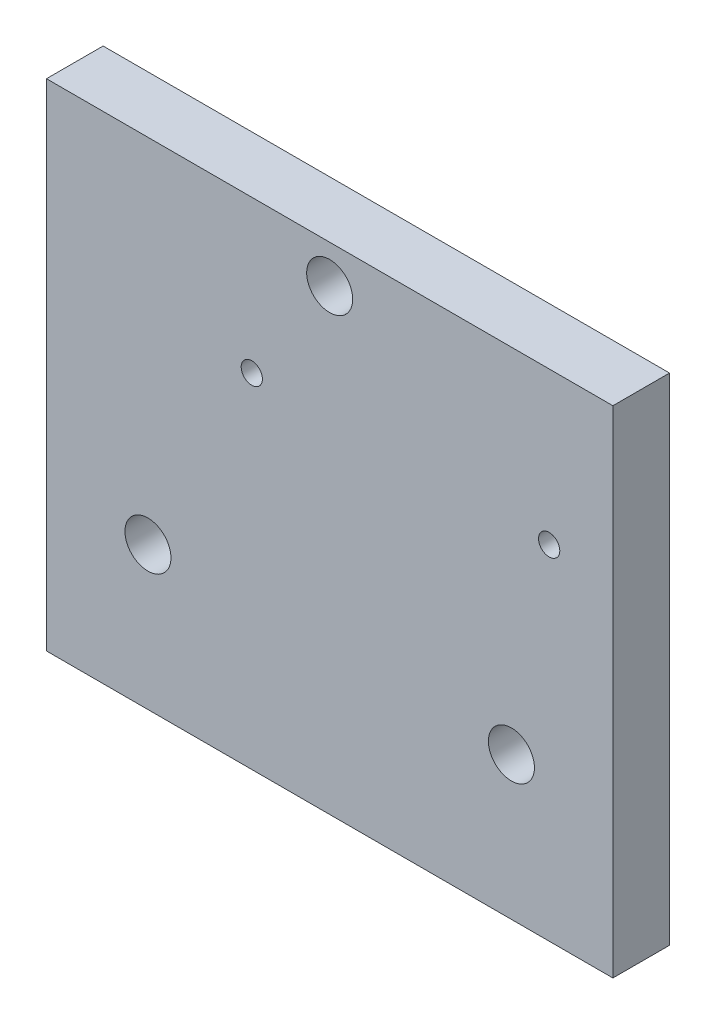
ISO-10303-21;
HEADER;
FILE_DESCRIPTION(('STEP AP214'),'2;1');
FILE_NAME('part.step','',(''),(''),'','','');
FILE_SCHEMA(('AUTOMOTIVE_DESIGN { 1 0 10303 214 1 1 1 1 }'));
ENDSEC;
DATA;
#1=APPLICATION_CONTEXT('core data for automotive mechanical design processes');
#2=APPLICATION_PROTOCOL_DEFINITION('international standard','automotive_design',2000,#1);
#3=PRODUCT_CONTEXT('',#1,'mechanical');
#4=PRODUCT('Part','Part','',(#3));
#5=PRODUCT_RELATED_PRODUCT_CATEGORY('part','',(#4));
#6=PRODUCT_DEFINITION_FORMATION('','',#4);
#7=PRODUCT_DEFINITION_CONTEXT('part definition',#1,'design');
#8=PRODUCT_DEFINITION('design','',#6,#7);
#9=PRODUCT_DEFINITION_SHAPE('','',#8);
#10=(LENGTH_UNIT() NAMED_UNIT(*) SI_UNIT(.MILLI.,.METRE.));
#11=(NAMED_UNIT(*) PLANE_ANGLE_UNIT() SI_UNIT($,.RADIAN.));
#12=(NAMED_UNIT(*) SI_UNIT($,.STERADIAN.) SOLID_ANGLE_UNIT());
#13=UNCERTAINTY_MEASURE_WITH_UNIT(LENGTH_MEASURE(1.E-05),#10,'distance_accuracy_value','');
#14=(GEOMETRIC_REPRESENTATION_CONTEXT(3) GLOBAL_UNCERTAINTY_ASSIGNED_CONTEXT((#13)) GLOBAL_UNIT_ASSIGNED_CONTEXT((#10,
#11,#12)) REPRESENTATION_CONTEXT('',''));
#15=CARTESIAN_POINT('',(0.,0.,0.));
#16=DIRECTION('',(0.,0.,1.));
#17=DIRECTION('',(1.,0.,0.));
#18=AXIS2_PLACEMENT_3D('',#15,#16,#17);
#19=CARTESIAN_POINT('',(0.,0.,16.));
#20=DIRECTION('',(-1.,0.,0.));
#21=DIRECTION('',(0.,-1.,0.));
#22=AXIS2_PLACEMENT_3D('',#19,#20,#21);
#23=PLANE('',#22);
#24=DIRECTION('',(0.,1.,0.));
#25=VECTOR('',#24,1.);
#26=CARTESIAN_POINT('',(0.,0.,0.));
#27=LINE('',#26,#25);
#28=CARTESIAN_POINT('',(0.,-140.,0.));
#29=VERTEX_POINT('',#28);
#30=CARTESIAN_POINT('',(0.,0.,0.));
#31=VERTEX_POINT('',#30);
#32=EDGE_CURVE('E98',#29,#31,#27,.T.);
#33=ORIENTED_EDGE('',*,*,#32,.T.);
#34=DIRECTION('',(0.,0.,-1.));
#35=VECTOR('',#34,1.);
#36=CARTESIAN_POINT('',(0.,0.,16.));
#37=LINE('',#36,#35);
#38=CARTESIAN_POINT('',(0.,0.,16.));
#39=VERTEX_POINT('',#38);
#40=EDGE_CURVE('E11',#39,#31,#37,.T.);
#41=ORIENTED_EDGE('',*,*,#40,.F.);
#42=DIRECTION('',(0.,1.,0.));
#43=VECTOR('',#42,1.);
#44=CARTESIAN_POINT('',(0.,0.,16.));
#45=LINE('',#44,#43);
#46=CARTESIAN_POINT('',(0.,-140.,16.));
#47=VERTEX_POINT('',#46);
#48=EDGE_CURVE('E86',#47,#39,#45,.T.);
#49=ORIENTED_EDGE('',*,*,#48,.F.);
#50=DIRECTION('',(0.,0.,-1.));
#51=VECTOR('',#50,1.);
#52=CARTESIAN_POINT('',(0.,-140.,16.));
#53=LINE('',#52,#51);
#54=EDGE_CURVE('E94',#47,#29,#53,.T.);
#55=ORIENTED_EDGE('',*,*,#54,.T.);
#56=EDGE_LOOP('',(#33,#41,#49,#55));
#57=FACE_BOUND('',#56,.T.);
#58=ADVANCED_FACE('F35',(#57),#23,.F.);
#59=CARTESIAN_POINT('',(0.,0.,16.));
#60=DIRECTION('',(0.,-1.,0.));
#61=DIRECTION('',(0.,0.,-1.));
#62=AXIS2_PLACEMENT_3D('',#59,#60,#61);
#63=PLANE('',#62);
#64=DIRECTION('',(-1.,0.,0.));
#65=VECTOR('',#64,1.);
#66=CARTESIAN_POINT('',(0.,0.,0.));
#67=LINE('',#66,#65);
#68=CARTESIAN_POINT('',(-160.,0.,0.));
#69=VERTEX_POINT('',#68);
#70=EDGE_CURVE('E90',#31,#69,#67,.T.);
#71=ORIENTED_EDGE('',*,*,#70,.T.);
#72=DIRECTION('',(0.,0.,-1.));
#73=VECTOR('',#72,1.);
#74=CARTESIAN_POINT('',(-160.,0.,16.));
#75=LINE('',#74,#73);
#76=CARTESIAN_POINT('',(-160.,0.,16.));
#77=VERTEX_POINT('',#76);
#78=EDGE_CURVE('E43',#77,#69,#75,.T.);
#79=ORIENTED_EDGE('',*,*,#78,.F.);
#80=DIRECTION('',(-1.,0.,0.));
#81=VECTOR('',#80,1.);
#82=CARTESIAN_POINT('',(0.,0.,16.));
#83=LINE('',#82,#81);
#84=EDGE_CURVE('E81',#39,#77,#83,.T.);
#85=ORIENTED_EDGE('',*,*,#84,.F.);
#86=ORIENTED_EDGE('',*,*,#40,.T.);
#87=EDGE_LOOP('',(#71,#79,#85,#86));
#88=FACE_BOUND('',#87,.T.);
#89=ADVANCED_FACE('F89',(#88),#63,.F.);
#90=CARTESIAN_POINT('',(-160.,0.,16.));
#91=DIRECTION('',(1.,0.,0.));
#92=DIRECTION('',(0.,1.,0.));
#93=AXIS2_PLACEMENT_3D('',#90,#91,#92);
#94=PLANE('',#93);
#95=DIRECTION('',(0.,-1.,0.));
#96=VECTOR('',#95,1.);
#97=CARTESIAN_POINT('',(-160.,0.,0.));
#98=LINE('',#97,#96);
#99=CARTESIAN_POINT('',(-160.,-140.,0.));
#100=VERTEX_POINT('',#99);
#101=EDGE_CURVE('E68',#69,#100,#98,.T.);
#102=ORIENTED_EDGE('',*,*,#101,.T.);
#103=DIRECTION('',(0.,0.,-1.));
#104=VECTOR('',#103,1.);
#105=CARTESIAN_POINT('',(-160.,-140.,16.));
#106=LINE('',#105,#104);
#107=CARTESIAN_POINT('',(-160.,-140.,16.));
#108=VERTEX_POINT('',#107);
#109=EDGE_CURVE('E91',#108,#100,#106,.T.);
#110=ORIENTED_EDGE('',*,*,#109,.F.);
#111=DIRECTION('',(0.,-1.,0.));
#112=VECTOR('',#111,1.);
#113=CARTESIAN_POINT('',(-160.,0.,16.));
#114=LINE('',#113,#112);
#115=EDGE_CURVE('E84',#77,#108,#114,.T.);
#116=ORIENTED_EDGE('',*,*,#115,.F.);
#117=ORIENTED_EDGE('',*,*,#78,.T.);
#118=EDGE_LOOP('',(#102,#110,#116,#117));
#119=FACE_BOUND('',#118,.T.);
#120=ADVANCED_FACE('F92',(#119),#94,.F.);
#121=CARTESIAN_POINT('',(0.,-140.,16.));
#122=DIRECTION('',(0.,1.,0.));
#123=DIRECTION('',(-1.,0.,0.));
#124=AXIS2_PLACEMENT_3D('',#121,#122,#123);
#125=PLANE('',#124);
#126=DIRECTION('',(1.,0.,0.));
#127=VECTOR('',#126,1.);
#128=CARTESIAN_POINT('',(0.,-140.,0.));
#129=LINE('',#128,#127);
#130=EDGE_CURVE('E74',#100,#29,#129,.T.);
#131=ORIENTED_EDGE('',*,*,#130,.T.);
#132=ORIENTED_EDGE('',*,*,#54,.F.);
#133=DIRECTION('',(1.,0.,0.));
#134=VECTOR('',#133,1.);
#135=CARTESIAN_POINT('',(0.,-140.,16.));
#136=LINE('',#135,#134);
#137=EDGE_CURVE('E51',#108,#47,#136,.T.);
#138=ORIENTED_EDGE('',*,*,#137,.F.);
#139=ORIENTED_EDGE('',*,*,#109,.T.);
#140=EDGE_LOOP('',(#131,#132,#138,#139));
#141=FACE_BOUND('',#140,.T.);
#142=ADVANCED_FACE('F106',(#141),#125,.F.);
#143=CARTESIAN_POINT('',(0.,0.,16.));
#144=DIRECTION('',(0.,0.,-1.));
#145=DIRECTION('',(-1.,0.,0.));
#146=AXIS2_PLACEMENT_3D('',#143,#144,#145);
#147=PLANE('',#146);
#148=CARTESIAN_POINT('',(-18.,-43.,16.));
#149=DIRECTION('',(0.,0.,1.));
#150=DIRECTION('',(1.,0.,0.));
#151=AXIS2_PLACEMENT_3D('',#148,#149,#150);
#152=CIRCLE('',#151,3.);
#153=CARTESIAN_POINT('',(-15.,-43.,16.));
#154=VERTEX_POINT('',#153);
#155=EDGE_CURVE('E136',#154,#154,#152,.T.);
#156=ORIENTED_EDGE('',*,*,#155,.F.);
#157=EDGE_LOOP('',(#156));
#158=FACE_BOUND('',#157,.T.);
#159=CARTESIAN_POINT('',(-102.,-43.,16.));
#160=DIRECTION('',(0.,0.,1.));
#161=DIRECTION('',(1.,0.,0.));
#162=AXIS2_PLACEMENT_3D('',#159,#160,#161);
#163=CIRCLE('',#162,2.99999999999999);
#164=CARTESIAN_POINT('',(-99.,-43.,16.));
#165=VERTEX_POINT('',#164);
#166=EDGE_CURVE('E130',#165,#165,#163,.T.);
#167=ORIENTED_EDGE('',*,*,#166,.F.);
#168=EDGE_LOOP('',(#167));
#169=FACE_BOUND('',#168,.T.);
#170=CARTESIAN_POINT('',(-131.336336798118,-99.6390478696029,16.));
#171=DIRECTION('',(0.,0.,1.));
#172=DIRECTION('',(1.,0.,0.));
#173=AXIS2_PLACEMENT_3D('',#170,#171,#172);
#174=CIRCLE('',#173,6.50000000000002);
#175=CARTESIAN_POINT('',(-124.836336798118,-99.6390478696029,16.));
#176=VERTEX_POINT('',#175);
#177=EDGE_CURVE('E125',#176,#176,#174,.T.);
#178=ORIENTED_EDGE('',*,*,#177,.F.);
#179=EDGE_LOOP('',(#178));
#180=FACE_BOUND('',#179,.T.);
#181=CARTESIAN_POINT('',(-80.,-10.7219042607942,16.));
#182=DIRECTION('',(0.,0.,1.));
#183=DIRECTION('',(1.,0.,0.));
#184=AXIS2_PLACEMENT_3D('',#181,#182,#183);
#185=CIRCLE('',#184,6.5);
#186=CARTESIAN_POINT('',(-73.5,-10.7219042607942,16.));
#187=VERTEX_POINT('',#186);
#188=EDGE_CURVE('E119',#187,#187,#185,.T.);
#189=ORIENTED_EDGE('',*,*,#188,.F.);
#190=EDGE_LOOP('',(#189));
#191=FACE_BOUND('',#190,.T.);
#192=CARTESIAN_POINT('',(-28.6636632018817,-99.6390478696029,16.));
#193=DIRECTION('',(0.,0.,1.));
#194=DIRECTION('',(1.,0.,0.));
#195=AXIS2_PLACEMENT_3D('',#192,#193,#194);
#196=CIRCLE('',#195,6.50000000000001);
#197=CARTESIAN_POINT('',(-22.1636632018817,-99.6390478696029,16.));
#198=VERTEX_POINT('',#197);
#199=EDGE_CURVE('E112',#198,#198,#196,.T.);
#200=ORIENTED_EDGE('',*,*,#199,.F.);
#201=EDGE_LOOP('',(#200));
#202=FACE_BOUND('',#201,.T.);
#203=ORIENTED_EDGE('',*,*,#48,.T.);
#204=ORIENTED_EDGE('',*,*,#84,.T.);
#205=ORIENTED_EDGE('',*,*,#115,.T.);
#206=ORIENTED_EDGE('',*,*,#137,.T.);
#207=EDGE_LOOP('',(#203,#204,#205,#206));
#208=FACE_BOUND('',#207,.T.);
#209=ADVANCED_FACE('F82',(#158,#169,#180,#191,#202,#208),#147,.F.);
#210=CARTESIAN_POINT('',(0.,0.,0.));
#211=DIRECTION('',(0.,0.,-1.));
#212=DIRECTION('',(-1.,0.,0.));
#213=AXIS2_PLACEMENT_3D('',#210,#211,#212);
#214=PLANE('',#213);
#215=CARTESIAN_POINT('',(-18.,-43.,0.));
#216=DIRECTION('',(0.,0.,1.));
#217=DIRECTION('',(1.,0.,0.));
#218=AXIS2_PLACEMENT_3D('',#215,#216,#217);
#219=CIRCLE('',#218,3.);
#220=CARTESIAN_POINT('',(-15.,-43.,0.));
#221=VERTEX_POINT('',#220);
#222=EDGE_CURVE('E116',#221,#221,#219,.T.);
#223=ORIENTED_EDGE('',*,*,#222,.T.);
#224=EDGE_LOOP('',(#223));
#225=FACE_BOUND('',#224,.T.);
#226=CARTESIAN_POINT('',(-102.,-43.,0.));
#227=DIRECTION('',(0.,0.,1.));
#228=DIRECTION('',(1.,0.,0.));
#229=AXIS2_PLACEMENT_3D('',#226,#227,#228);
#230=CIRCLE('',#229,2.99999999999999);
#231=CARTESIAN_POINT('',(-99.,-43.,0.));
#232=VERTEX_POINT('',#231);
#233=EDGE_CURVE('E133',#232,#232,#230,.T.);
#234=ORIENTED_EDGE('',*,*,#233,.T.);
#235=EDGE_LOOP('',(#234));
#236=FACE_BOUND('',#235,.T.);
#237=ORIENTED_EDGE('',*,*,#32,.F.);
#238=ORIENTED_EDGE('',*,*,#130,.F.);
#239=ORIENTED_EDGE('',*,*,#101,.F.);
#240=ORIENTED_EDGE('',*,*,#70,.F.);
#241=EDGE_LOOP('',(#237,#238,#239,#240));
#242=FACE_BOUND('',#241,.T.);
#243=ADVANCED_FACE('F109',(#225,#236,#242),#214,.T.);
#244=CARTESIAN_POINT('',(-28.6636632018817,-99.6390478696029,5.));
#245=DIRECTION('',(0.,0.,1.));
#246=DIRECTION('',(1.,0.,0.));
#247=AXIS2_PLACEMENT_3D('',#244,#245,#246);
#248=CYLINDRICAL_SURFACE('',#247,6.50000000000001);
#249=CARTESIAN_POINT('',(-28.6636632018817,-99.6390478696029,5.));
#250=DIRECTION('',(0.,0.,1.));
#251=DIRECTION('',(1.,0.,0.));
#252=AXIS2_PLACEMENT_3D('',#249,#250,#251);
#253=CIRCLE('',#252,6.50000000000001);
#254=CARTESIAN_POINT('',(-22.1636632018817,-99.6390478696029,5.));
#255=VERTEX_POINT('',#254);
#256=EDGE_CURVE('E115',#255,#255,#253,.T.);
#257=ORIENTED_EDGE('',*,*,#256,.F.);
#258=EDGE_LOOP('',(#257));
#259=FACE_BOUND('',#258,.T.);
#260=ORIENTED_EDGE('',*,*,#199,.T.);
#261=EDGE_LOOP('',(#260));
#262=FACE_BOUND('',#261,.T.);
#263=ADVANCED_FACE('F162',(#259,#262),#248,.F.);
#264=CARTESIAN_POINT('',(-28.6636632018817,-99.6390478696029,5.));
#265=DIRECTION('',(0.,0.,1.));
#266=DIRECTION('',(1.,0.,0.));
#267=AXIS2_PLACEMENT_3D('',#264,#265,#266);
#268=PLANE('',#267);
#269=ORIENTED_EDGE('',*,*,#256,.T.);
#270=EDGE_LOOP('',(#269));
#271=FACE_BOUND('',#270,.T.);
#272=ADVANCED_FACE('F164',(#271),#268,.T.);
#273=CARTESIAN_POINT('',(-80.,-10.7219042607942,5.));
#274=DIRECTION('',(0.,0.,1.));
#275=DIRECTION('',(1.,0.,0.));
#276=AXIS2_PLACEMENT_3D('',#273,#274,#275);
#277=CYLINDRICAL_SURFACE('',#276,6.5);
#278=CARTESIAN_POINT('',(-80.,-10.7219042607942,5.));
#279=DIRECTION('',(0.,0.,1.));
#280=DIRECTION('',(1.,0.,0.));
#281=AXIS2_PLACEMENT_3D('',#278,#279,#280);
#282=CIRCLE('',#281,6.5);
#283=CARTESIAN_POINT('',(-73.5,-10.7219042607942,5.));
#284=VERTEX_POINT('',#283);
#285=EDGE_CURVE('E122',#284,#284,#282,.T.);
#286=ORIENTED_EDGE('',*,*,#285,.F.);
#287=EDGE_LOOP('',(#286));
#288=FACE_BOUND('',#287,.T.);
#289=ORIENTED_EDGE('',*,*,#188,.T.);
#290=EDGE_LOOP('',(#289));
#291=FACE_BOUND('',#290,.T.);
#292=ADVANCED_FACE('F171',(#288,#291),#277,.F.);
#293=CARTESIAN_POINT('',(-80.,-10.7219042607942,5.));
#294=DIRECTION('',(0.,0.,1.));
#295=DIRECTION('',(1.,0.,0.));
#296=AXIS2_PLACEMENT_3D('',#293,#294,#295);
#297=PLANE('',#296);
#298=ORIENTED_EDGE('',*,*,#285,.T.);
#299=EDGE_LOOP('',(#298));
#300=FACE_BOUND('',#299,.T.);
#301=ADVANCED_FACE('F231',(#300),#297,.T.);
#302=CARTESIAN_POINT('',(-131.336336798118,-99.6390478696029,5.));
#303=DIRECTION('',(0.,0.,1.));
#304=DIRECTION('',(1.,0.,0.));
#305=AXIS2_PLACEMENT_3D('',#302,#303,#304);
#306=CYLINDRICAL_SURFACE('',#305,6.50000000000002);
#307=CARTESIAN_POINT('',(-131.336336798118,-99.6390478696029,5.));
#308=DIRECTION('',(0.,0.,1.));
#309=DIRECTION('',(1.,0.,0.));
#310=AXIS2_PLACEMENT_3D('',#307,#308,#309);
#311=CIRCLE('',#310,6.50000000000002);
#312=CARTESIAN_POINT('',(-124.836336798118,-99.6390478696029,5.));
#313=VERTEX_POINT('',#312);
#314=EDGE_CURVE('E101',#313,#313,#311,.T.);
#315=ORIENTED_EDGE('',*,*,#314,.F.);
#316=EDGE_LOOP('',(#315));
#317=FACE_BOUND('',#316,.T.);
#318=ORIENTED_EDGE('',*,*,#177,.T.);
#319=EDGE_LOOP('',(#318));
#320=FACE_BOUND('',#319,.T.);
#321=ADVANCED_FACE('F224',(#317,#320),#306,.F.);
#322=CARTESIAN_POINT('',(-131.336336798118,-99.6390478696029,5.));
#323=DIRECTION('',(0.,0.,1.));
#324=DIRECTION('',(1.,0.,0.));
#325=AXIS2_PLACEMENT_3D('',#322,#323,#324);
#326=PLANE('',#325);
#327=ORIENTED_EDGE('',*,*,#314,.T.);
#328=EDGE_LOOP('',(#327));
#329=FACE_BOUND('',#328,.T.);
#330=ADVANCED_FACE('F209',(#329),#326,.T.);
#331=CARTESIAN_POINT('',(-102.,-43.,0.));
#332=DIRECTION('',(0.,0.,1.));
#333=DIRECTION('',(1.,0.,0.));
#334=AXIS2_PLACEMENT_3D('',#331,#332,#333);
#335=CYLINDRICAL_SURFACE('',#334,2.99999999999999);
#336=ORIENTED_EDGE('',*,*,#233,.F.);
#337=EDGE_LOOP('',(#336));
#338=FACE_BOUND('',#337,.T.);
#339=ORIENTED_EDGE('',*,*,#166,.T.);
#340=EDGE_LOOP('',(#339));
#341=FACE_BOUND('',#340,.T.);
#342=ADVANCED_FACE('F147',(#338,#341),#335,.F.);
#343=CARTESIAN_POINT('',(-18.,-43.,0.));
#344=DIRECTION('',(0.,0.,1.));
#345=DIRECTION('',(1.,0.,0.));
#346=AXIS2_PLACEMENT_3D('',#343,#344,#345);
#347=CYLINDRICAL_SURFACE('',#346,3.);
#348=ORIENTED_EDGE('',*,*,#222,.F.);
#349=EDGE_LOOP('',(#348));
#350=FACE_BOUND('',#349,.T.);
#351=ORIENTED_EDGE('',*,*,#155,.T.);
#352=EDGE_LOOP('',(#351));
#353=FACE_BOUND('',#352,.T.);
#354=ADVANCED_FACE('F144',(#350,#353),#347,.F.);
#355=CLOSED_SHELL('',(#58,#89,#120,#142,#209,#243,#263,#272,#292,#301,#321,#330,#342,#354));
#356=MANIFOLD_SOLID_BREP('B2',#355);
#357=ADVANCED_BREP_SHAPE_REPRESENTATION('',(#18,#356),#14);
#358=SHAPE_DEFINITION_REPRESENTATION(#9,#357);
ENDSEC;
END-ISO-10303-21;
